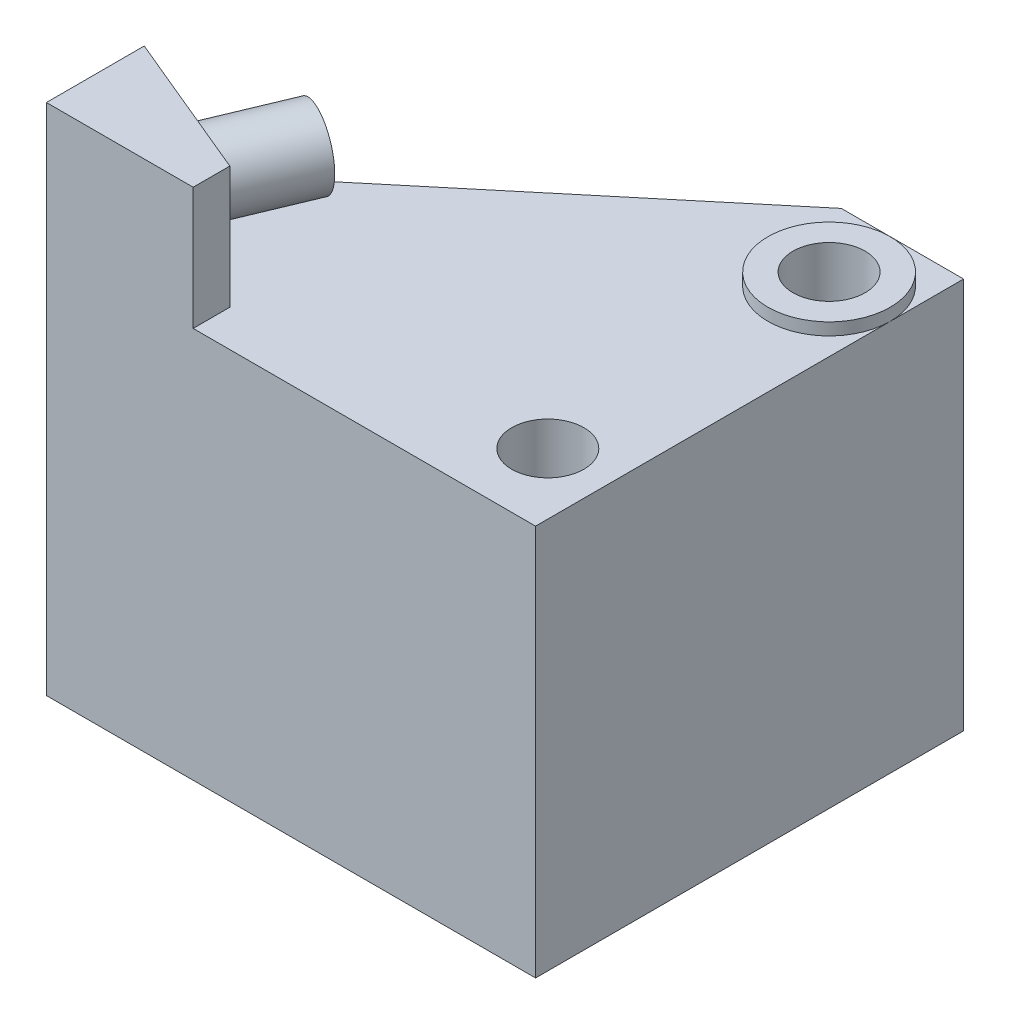
ISO-10303-21;
HEADER;
FILE_DESCRIPTION(('STEP AP214'),'2;1');
FILE_NAME('part.step','',(''),(''),'','','');
FILE_SCHEMA(('AUTOMOTIVE_DESIGN { 1 0 10303 214 1 1 1 1 }'));
ENDSEC;
DATA;
#1=APPLICATION_CONTEXT('core data for automotive mechanical design processes');
#2=APPLICATION_PROTOCOL_DEFINITION('international standard','automotive_design',2000,#1);
#3=PRODUCT_CONTEXT('',#1,'mechanical');
#4=PRODUCT('Part','Part','',(#3));
#5=PRODUCT_RELATED_PRODUCT_CATEGORY('part','',(#4));
#6=PRODUCT_DEFINITION_FORMATION('','',#4);
#7=PRODUCT_DEFINITION_CONTEXT('part definition',#1,'design');
#8=PRODUCT_DEFINITION('design','',#6,#7);
#9=PRODUCT_DEFINITION_SHAPE('','',#8);
#10=(LENGTH_UNIT() NAMED_UNIT(*) SI_UNIT(.MILLI.,.METRE.));
#11=(NAMED_UNIT(*) PLANE_ANGLE_UNIT() SI_UNIT($,.RADIAN.));
#12=(NAMED_UNIT(*) SI_UNIT($,.STERADIAN.) SOLID_ANGLE_UNIT());
#13=UNCERTAINTY_MEASURE_WITH_UNIT(LENGTH_MEASURE(1.E-05),#10,'distance_accuracy_value','');
#14=(GEOMETRIC_REPRESENTATION_CONTEXT(3) GLOBAL_UNCERTAINTY_ASSIGNED_CONTEXT((#13)) GLOBAL_UNIT_ASSIGNED_CONTEXT((#10,
#11,#12)) REPRESENTATION_CONTEXT('',''));
#15=CARTESIAN_POINT('',(0.,0.,0.));
#16=DIRECTION('',(0.,0.,1.));
#17=DIRECTION('',(1.,0.,0.));
#18=AXIS2_PLACEMENT_3D('',#15,#16,#17);
#19=CARTESIAN_POINT('',(0.,16.,0.));
#20=DIRECTION('',(0.,-1.,0.));
#21=DIRECTION('',(0.,0.,-1.));
#22=AXIS2_PLACEMENT_3D('',#19,#20,#21);
#23=PLANE('',#22);
#24=CARTESIAN_POINT('',(-2.5,16.,-3.));
#25=DIRECTION('',(0.,1.,0.));
#26=DIRECTION('',(0.,0.,1.));
#27=AXIS2_PLACEMENT_3D('',#24,#25,#26);
#28=CIRCLE('',#27,1.475);
#29=CARTESIAN_POINT('',(-2.5,16.,-1.525));
#30=VERTEX_POINT('',#29);
#31=EDGE_CURVE('E199',#30,#30,#28,.T.);
#32=ORIENTED_EDGE('',*,*,#31,.F.);
#33=EDGE_LOOP('',(#32));
#34=FACE_BOUND('',#33,.T.);
#35=DIRECTION('',(0.,0.,-1.));
#36=VECTOR('',#35,1.);
#37=CARTESIAN_POINT('',(0.,16.,-17.5));
#38=LINE('',#37,#36);
#39=CARTESIAN_POINT('',(0.,16.,0.));
#40=VERTEX_POINT('',#39);
#41=CARTESIAN_POINT('',(0.,16.,-14.5));
#42=VERTEX_POINT('',#41);
#43=EDGE_CURVE('E112',#40,#42,#38,.T.);
#44=ORIENTED_EDGE('',*,*,#43,.T.);
#45=CARTESIAN_POINT('',(-2.5,16.,-14.5));
#46=DIRECTION('',(0.,1.,0.));
#47=DIRECTION('',(0.,0.,1.));
#48=AXIS2_PLACEMENT_3D('',#45,#46,#47);
#49=CIRCLE('',#48,2.5);
#50=EDGE_CURVE('E115',#42,#42,#49,.T.);
#51=ORIENTED_EDGE('',*,*,#50,.F.);
#52=CARTESIAN_POINT('',(0.,16.,-17.5));
#53=VERTEX_POINT('',#52);
#54=EDGE_CURVE('E122',#42,#53,#38,.T.);
#55=ORIENTED_EDGE('',*,*,#54,.T.);
#56=DIRECTION('',(-1.,0.,0.));
#57=VECTOR('',#56,1.);
#58=CARTESIAN_POINT('',(-5.,16.,-17.5));
#59=LINE('',#58,#57);
#60=CARTESIAN_POINT('',(-5.,16.,-17.5));
#61=VERTEX_POINT('',#60);
#62=EDGE_CURVE('E121',#53,#61,#59,.T.);
#63=ORIENTED_EDGE('',*,*,#62,.T.);
#64=DIRECTION('',(-0.768221279597376,0.,0.64018439966448));
#65=VECTOR('',#64,1.);
#66=CARTESIAN_POINT('',(-20.,16.,-5.));
#67=LINE('',#66,#65);
#68=CARTESIAN_POINT('',(-20.,16.,-5.));
#69=VERTEX_POINT('',#68);
#70=EDGE_CURVE('E136',#61,#69,#67,.T.);
#71=ORIENTED_EDGE('',*,*,#70,.T.);
#72=DIRECTION('',(0.,0.,1.));
#73=VECTOR('',#72,1.);
#74=CARTESIAN_POINT('',(-20.,16.,0.));
#75=LINE('',#74,#73);
#76=CARTESIAN_POINT('',(-20.,16.,-4.));
#77=VERTEX_POINT('',#76);
#78=EDGE_CURVE('E67',#69,#77,#75,.T.);
#79=ORIENTED_EDGE('',*,*,#78,.T.);
#80=DIRECTION('',(-0.923076923076923,0.,-0.384615384615385));
#81=VECTOR('',#80,1.);
#82=CARTESIAN_POINT('',(-14.,16.,-1.5));
#83=LINE('',#82,#81);
#84=CARTESIAN_POINT('',(-14.,16.,-1.5));
#85=VERTEX_POINT('',#84);
#86=EDGE_CURVE('E220',#85,#77,#83,.T.);
#87=ORIENTED_EDGE('',*,*,#86,.F.);
#88=DIRECTION('',(0.,0.,-1.));
#89=VECTOR('',#88,1.);
#90=CARTESIAN_POINT('',(-14.,16.,0.));
#91=LINE('',#90,#89);
#92=CARTESIAN_POINT('',(-14.,16.,0.));
#93=VERTEX_POINT('',#92);
#94=EDGE_CURVE('E61',#93,#85,#91,.T.);
#95=ORIENTED_EDGE('',*,*,#94,.F.);
#96=DIRECTION('',(1.,0.,0.));
#97=VECTOR('',#96,1.);
#98=CARTESIAN_POINT('',(0.,16.,0.));
#99=LINE('',#98,#97);
#100=EDGE_CURVE('E116',#93,#40,#99,.T.);
#101=ORIENTED_EDGE('',*,*,#100,.T.);
#102=EDGE_LOOP('',(#44,#51,#55,#63,#71,#79,#87,#95,#101));
#103=FACE_BOUND('',#102,.T.);
#104=ADVANCED_FACE('F45',(#34,#103),#23,.F.);
#105=CARTESIAN_POINT('',(-20.,16.,0.));
#106=DIRECTION('',(1.,0.,0.));
#107=DIRECTION('',(0.,0.,-1.));
#108=AXIS2_PLACEMENT_3D('',#105,#106,#107);
#109=PLANE('',#108);
#110=DIRECTION('',(0.,0.,1.));
#111=VECTOR('',#110,1.);
#112=CARTESIAN_POINT('',(-20.,0.,0.));
#113=LINE('',#112,#111);
#114=CARTESIAN_POINT('',(-20.,0.,-5.));
#115=VERTEX_POINT('',#114);
#116=CARTESIAN_POINT('',(-20.,0.,0.));
#117=VERTEX_POINT('',#116);
#118=EDGE_CURVE('E140',#115,#117,#113,.T.);
#119=ORIENTED_EDGE('',*,*,#118,.T.);
#120=DIRECTION('',(0.,-1.,0.));
#121=VECTOR('',#120,1.);
#122=CARTESIAN_POINT('',(-20.,16.,0.));
#123=LINE('',#122,#121);
#124=CARTESIAN_POINT('',(-20.,21.,0.));
#125=VERTEX_POINT('',#124);
#126=EDGE_CURVE('E54',#125,#117,#123,.T.);
#127=ORIENTED_EDGE('',*,*,#126,.F.);
#128=DIRECTION('',(0.,0.,1.));
#129=VECTOR('',#128,1.);
#130=CARTESIAN_POINT('',(-20.,21.,-4.));
#131=LINE('',#130,#129);
#132=CARTESIAN_POINT('',(-20.,21.,-4.));
#133=VERTEX_POINT('',#132);
#134=EDGE_CURVE('E228',#133,#125,#131,.T.);
#135=ORIENTED_EDGE('',*,*,#134,.F.);
#136=DIRECTION('',(0.,-1.,0.));
#137=VECTOR('',#136,1.);
#138=CARTESIAN_POINT('',(-20.,21.,-4.));
#139=LINE('',#138,#137);
#140=EDGE_CURVE('E191',#133,#77,#139,.T.);
#141=ORIENTED_EDGE('',*,*,#140,.T.);
#142=ORIENTED_EDGE('',*,*,#78,.F.);
#143=DIRECTION('',(0.,-1.,0.));
#144=VECTOR('',#143,1.);
#145=CARTESIAN_POINT('',(-20.,16.,-5.));
#146=LINE('',#145,#144);
#147=EDGE_CURVE('E139',#69,#115,#146,.T.);
#148=ORIENTED_EDGE('',*,*,#147,.T.);
#149=EDGE_LOOP('',(#119,#127,#135,#141,#142,#148));
#150=FACE_BOUND('',#149,.T.);
#151=ADVANCED_FACE('F47',(#150),#109,.F.);
#152=CARTESIAN_POINT('',(0.,16.,0.));
#153=DIRECTION('',(0.,0.,-1.));
#154=DIRECTION('',(-1.,0.,0.));
#155=AXIS2_PLACEMENT_3D('',#152,#153,#154);
#156=PLANE('',#155);
#157=DIRECTION('',(1.,0.,0.));
#158=VECTOR('',#157,1.);
#159=CARTESIAN_POINT('',(0.,0.,0.));
#160=LINE('',#159,#158);
#161=CARTESIAN_POINT('',(0.,0.,0.));
#162=VERTEX_POINT('',#161);
#163=EDGE_CURVE('E144',#117,#162,#160,.T.);
#164=ORIENTED_EDGE('',*,*,#163,.T.);
#165=DIRECTION('',(0.,-1.,0.));
#166=VECTOR('',#165,1.);
#167=CARTESIAN_POINT('',(0.,16.,0.));
#168=LINE('',#167,#166);
#169=EDGE_CURVE('E166',#40,#162,#168,.T.);
#170=ORIENTED_EDGE('',*,*,#169,.F.);
#171=ORIENTED_EDGE('',*,*,#100,.F.);
#172=DIRECTION('',(0.,-1.,0.));
#173=VECTOR('',#172,1.);
#174=CARTESIAN_POINT('',(-14.,21.,0.));
#175=LINE('',#174,#173);
#176=CARTESIAN_POINT('',(-14.,21.,0.));
#177=VERTEX_POINT('',#176);
#178=EDGE_CURVE('E208',#177,#93,#175,.T.);
#179=ORIENTED_EDGE('',*,*,#178,.F.);
#180=DIRECTION('',(1.,0.,0.));
#181=VECTOR('',#180,1.);
#182=CARTESIAN_POINT('',(-20.,21.,0.));
#183=LINE('',#182,#181);
#184=EDGE_CURVE('E174',#125,#177,#183,.T.);
#185=ORIENTED_EDGE('',*,*,#184,.F.);
#186=ORIENTED_EDGE('',*,*,#126,.T.);
#187=EDGE_LOOP('',(#164,#170,#171,#179,#185,#186));
#188=FACE_BOUND('',#187,.T.);
#189=ADVANCED_FACE('F172',(#188),#156,.F.);
#190=CARTESIAN_POINT('',(0.,16.,-17.5));
#191=DIRECTION('',(-1.,0.,0.));
#192=DIRECTION('',(0.,0.,1.));
#193=AXIS2_PLACEMENT_3D('',#190,#191,#192);
#194=PLANE('',#193);
#195=DIRECTION('',(0.,0.,-1.));
#196=VECTOR('',#195,1.);
#197=CARTESIAN_POINT('',(0.,0.,-17.5));
#198=LINE('',#197,#196);
#199=CARTESIAN_POINT('',(0.,0.,-17.5));
#200=VERTEX_POINT('',#199);
#201=EDGE_CURVE('E148',#162,#200,#198,.T.);
#202=ORIENTED_EDGE('',*,*,#201,.T.);
#203=DIRECTION('',(0.,-1.,0.));
#204=VECTOR('',#203,1.);
#205=CARTESIAN_POINT('',(0.,16.,-17.5));
#206=LINE('',#205,#204);
#207=EDGE_CURVE('E127',#53,#200,#206,.T.);
#208=ORIENTED_EDGE('',*,*,#207,.F.);
#209=ORIENTED_EDGE('',*,*,#54,.F.);
#210=ORIENTED_EDGE('',*,*,#43,.F.);
#211=ORIENTED_EDGE('',*,*,#169,.T.);
#212=EDGE_LOOP('',(#202,#208,#209,#210,#211));
#213=FACE_BOUND('',#212,.T.);
#214=ADVANCED_FACE('F125',(#213),#194,.F.);
#215=CARTESIAN_POINT('',(-5.,16.,-17.5));
#216=DIRECTION('',(0.,0.,1.));
#217=DIRECTION('',(1.,0.,0.));
#218=AXIS2_PLACEMENT_3D('',#215,#216,#217);
#219=PLANE('',#218);
#220=DIRECTION('',(-1.,0.,0.));
#221=VECTOR('',#220,1.);
#222=CARTESIAN_POINT('',(-5.,0.,-17.5));
#223=LINE('',#222,#221);
#224=CARTESIAN_POINT('',(-5.,0.,-17.5));
#225=VERTEX_POINT('',#224);
#226=EDGE_CURVE('E151',#200,#225,#223,.T.);
#227=ORIENTED_EDGE('',*,*,#226,.T.);
#228=DIRECTION('',(0.,-1.,0.));
#229=VECTOR('',#228,1.);
#230=CARTESIAN_POINT('',(-5.,16.,-17.5));
#231=LINE('',#230,#229);
#232=EDGE_CURVE('E160',#61,#225,#231,.T.);
#233=ORIENTED_EDGE('',*,*,#232,.F.);
#234=ORIENTED_EDGE('',*,*,#62,.F.);
#235=ORIENTED_EDGE('',*,*,#207,.T.);
#236=EDGE_LOOP('',(#227,#233,#234,#235));
#237=FACE_BOUND('',#236,.T.);
#238=ADVANCED_FACE('F185',(#237),#219,.F.);
#239=CARTESIAN_POINT('',(-20.,16.,-5.));
#240=DIRECTION('',(0.64018439966448,0.,0.768221279597376));
#241=DIRECTION('',(0.768221279597376,0.,-0.64018439966448));
#242=AXIS2_PLACEMENT_3D('',#239,#240,#241);
#243=PLANE('',#242);
#244=DIRECTION('',(-0.768221279597376,0.,0.64018439966448));
#245=VECTOR('',#244,1.);
#246=CARTESIAN_POINT('',(-20.,0.,-5.));
#247=LINE('',#246,#245);
#248=EDGE_CURVE('E154',#225,#115,#247,.T.);
#249=ORIENTED_EDGE('',*,*,#248,.T.);
#250=ORIENTED_EDGE('',*,*,#147,.F.);
#251=ORIENTED_EDGE('',*,*,#70,.F.);
#252=ORIENTED_EDGE('',*,*,#232,.T.);
#253=EDGE_LOOP('',(#249,#250,#251,#252));
#254=FACE_BOUND('',#253,.T.);
#255=ADVANCED_FACE('F189',(#254),#243,.F.);
#256=CARTESIAN_POINT('',(0.,0.,0.));
#257=DIRECTION('',(0.,-1.,0.));
#258=DIRECTION('',(0.,0.,-1.));
#259=AXIS2_PLACEMENT_3D('',#256,#257,#258);
#260=PLANE('',#259);
#261=CARTESIAN_POINT('',(-2.5,0.,-14.5));
#262=DIRECTION('',(0.,1.,0.));
#263=DIRECTION('',(0.,0.,1.));
#264=AXIS2_PLACEMENT_3D('',#261,#262,#263);
#265=CIRCLE('',#264,1.475);
#266=CARTESIAN_POINT('',(-2.5,0.,-13.025));
#267=VERTEX_POINT('',#266);
#268=EDGE_CURVE('E145',#267,#267,#265,.T.);
#269=ORIENTED_EDGE('',*,*,#268,.T.);
#270=EDGE_LOOP('',(#269));
#271=FACE_BOUND('',#270,.T.);
#272=CARTESIAN_POINT('',(-2.5,0.,-3.));
#273=DIRECTION('',(0.,1.,0.));
#274=DIRECTION('',(0.,0.,1.));
#275=AXIS2_PLACEMENT_3D('',#272,#273,#274);
#276=CIRCLE('',#275,1.475);
#277=CARTESIAN_POINT('',(-2.5,0.,-1.525));
#278=VERTEX_POINT('',#277);
#279=EDGE_CURVE('E195',#278,#278,#276,.T.);
#280=ORIENTED_EDGE('',*,*,#279,.T.);
#281=EDGE_LOOP('',(#280));
#282=FACE_BOUND('',#281,.T.);
#283=ORIENTED_EDGE('',*,*,#118,.F.);
#284=ORIENTED_EDGE('',*,*,#248,.F.);
#285=ORIENTED_EDGE('',*,*,#226,.F.);
#286=ORIENTED_EDGE('',*,*,#201,.F.);
#287=ORIENTED_EDGE('',*,*,#163,.F.);
#288=EDGE_LOOP('',(#283,#284,#285,#286,#287));
#289=FACE_BOUND('',#288,.T.);
#290=ADVANCED_FACE('F181',(#271,#282,#289),#260,.T.);
#291=CARTESIAN_POINT('',(-2.5,0.,-3.));
#292=DIRECTION('',(0.,1.,0.));
#293=DIRECTION('',(0.,0.,1.));
#294=AXIS2_PLACEMENT_3D('',#291,#292,#293);
#295=CYLINDRICAL_SURFACE('',#294,1.475);
#296=ORIENTED_EDGE('',*,*,#279,.F.);
#297=EDGE_LOOP('',(#296));
#298=FACE_BOUND('',#297,.T.);
#299=ORIENTED_EDGE('',*,*,#31,.T.);
#300=EDGE_LOOP('',(#299));
#301=FACE_BOUND('',#300,.T.);
#302=ADVANCED_FACE('F290',(#298,#301),#295,.F.);
#303=CARTESIAN_POINT('',(-2.5,0.,-14.5));
#304=DIRECTION('',(0.,1.,0.));
#305=DIRECTION('',(0.,0.,1.));
#306=AXIS2_PLACEMENT_3D('',#303,#304,#305);
#307=CYLINDRICAL_SURFACE('',#306,1.475);
#308=ORIENTED_EDGE('',*,*,#268,.F.);
#309=EDGE_LOOP('',(#308));
#310=FACE_BOUND('',#309,.T.);
#311=CARTESIAN_POINT('',(-2.5,16.5,-14.5));
#312=DIRECTION('',(0.,1.,0.));
#313=DIRECTION('',(0.,0.,1.));
#314=AXIS2_PLACEMENT_3D('',#311,#312,#313);
#315=CIRCLE('',#314,1.475);
#316=CARTESIAN_POINT('',(-2.5,16.5,-13.025));
#317=VERTEX_POINT('',#316);
#318=EDGE_CURVE('E236',#317,#317,#315,.T.);
#319=ORIENTED_EDGE('',*,*,#318,.T.);
#320=EDGE_LOOP('',(#319));
#321=FACE_BOUND('',#320,.T.);
#322=ADVANCED_FACE('F261',(#310,#321),#307,.F.);
#323=CARTESIAN_POINT('',(-14.,21.,-1.5));
#324=DIRECTION('',(-0.384615384615385,0.,0.923076923076923));
#325=DIRECTION('',(0.923076923076923,0.,0.384615384615385));
#326=AXIS2_PLACEMENT_3D('',#323,#324,#325);
#327=PLANE('',#326);
#328=CARTESIAN_POINT('',(-17.,18.5,-2.75000000000001));
#329=DIRECTION('',(-0.384615384615385,0.,0.923076923076923));
#330=DIRECTION('',(0.923076923076923,0.,0.384615384615385));
#331=AXIS2_PLACEMENT_3D('',#328,#329,#330);
#332=CIRCLE('',#331,1.5);
#333=CARTESIAN_POINT('',(-15.6153846153847,18.5,-2.17307692307694));
#334=VERTEX_POINT('',#333);
#335=EDGE_CURVE('E11',#334,#334,#332,.F.);
#336=ORIENTED_EDGE('',*,*,#335,.F.);
#337=EDGE_LOOP('',(#336));
#338=FACE_BOUND('',#337,.T.);
#339=ORIENTED_EDGE('',*,*,#86,.T.);
#340=ORIENTED_EDGE('',*,*,#140,.F.);
#341=DIRECTION('',(-0.923076923076923,0.,-0.384615384615385));
#342=VECTOR('',#341,1.);
#343=CARTESIAN_POINT('',(-14.,21.,-1.5));
#344=LINE('',#343,#342);
#345=CARTESIAN_POINT('',(-14.,21.,-1.5));
#346=VERTEX_POINT('',#345);
#347=EDGE_CURVE('E219',#346,#133,#344,.T.);
#348=ORIENTED_EDGE('',*,*,#347,.F.);
#349=DIRECTION('',(0.,-1.,0.));
#350=VECTOR('',#349,1.);
#351=CARTESIAN_POINT('',(-14.,21.,-1.5));
#352=LINE('',#351,#350);
#353=EDGE_CURVE('E212',#346,#85,#352,.T.);
#354=ORIENTED_EDGE('',*,*,#353,.T.);
#355=EDGE_LOOP('',(#339,#340,#348,#354));
#356=FACE_BOUND('',#355,.T.);
#357=ADVANCED_FACE('F257',(#338,#356),#327,.F.);
#358=CARTESIAN_POINT('',(-14.,21.,0.));
#359=DIRECTION('',(-1.,0.,0.));
#360=DIRECTION('',(0.,0.,1.));
#361=AXIS2_PLACEMENT_3D('',#358,#359,#360);
#362=PLANE('',#361);
#363=ORIENTED_EDGE('',*,*,#94,.T.);
#364=ORIENTED_EDGE('',*,*,#353,.F.);
#365=DIRECTION('',(0.,0.,-1.));
#366=VECTOR('',#365,1.);
#367=CARTESIAN_POINT('',(-14.,21.,0.));
#368=LINE('',#367,#366);
#369=EDGE_CURVE('E216',#177,#346,#368,.T.);
#370=ORIENTED_EDGE('',*,*,#369,.F.);
#371=ORIENTED_EDGE('',*,*,#178,.T.);
#372=EDGE_LOOP('',(#363,#364,#370,#371));
#373=FACE_BOUND('',#372,.T.);
#374=ADVANCED_FACE('F260',(#373),#362,.F.);
#375=CARTESIAN_POINT('',(0.,21.,0.));
#376=DIRECTION('',(0.,1.,0.));
#377=DIRECTION('',(0.,0.,1.));
#378=AXIS2_PLACEMENT_3D('',#375,#376,#377);
#379=PLANE('',#378);
#380=ORIENTED_EDGE('',*,*,#347,.T.);
#381=ORIENTED_EDGE('',*,*,#134,.T.);
#382=ORIENTED_EDGE('',*,*,#184,.T.);
#383=ORIENTED_EDGE('',*,*,#369,.T.);
#384=EDGE_LOOP('',(#380,#381,#382,#383));
#385=FACE_BOUND('',#384,.T.);
#386=ADVANCED_FACE('F268',(#385),#379,.T.);
#387=CARTESIAN_POINT('',(-2.5,16.5,-14.5));
#388=DIRECTION('',(0.,1.,0.));
#389=DIRECTION('',(0.,0.,1.));
#390=AXIS2_PLACEMENT_3D('',#387,#388,#389);
#391=PLANE('',#390);
#392=CARTESIAN_POINT('',(-2.5,16.5,-14.5));
#393=DIRECTION('',(0.,1.,0.));
#394=DIRECTION('',(0.,0.,1.));
#395=AXIS2_PLACEMENT_3D('',#392,#393,#394);
#396=CIRCLE('',#395,2.5);
#397=CARTESIAN_POINT('',(-2.5,16.5,-12.));
#398=VERTEX_POINT('',#397);
#399=EDGE_CURVE('E223',#398,#398,#396,.T.);
#400=ORIENTED_EDGE('',*,*,#399,.T.);
#401=EDGE_LOOP('',(#400));
#402=FACE_BOUND('',#401,.T.);
#403=ORIENTED_EDGE('',*,*,#318,.F.);
#404=EDGE_LOOP('',(#403));
#405=FACE_BOUND('',#404,.T.);
#406=ADVANCED_FACE('F270',(#402,#405),#391,.T.);
#407=CARTESIAN_POINT('',(-2.5,16.5,-14.5));
#408=DIRECTION('',(0.,-1.,0.));
#409=DIRECTION('',(0.,0.,-1.));
#410=AXIS2_PLACEMENT_3D('',#407,#408,#409);
#411=CYLINDRICAL_SURFACE('',#410,2.5);
#412=ORIENTED_EDGE('',*,*,#399,.F.);
#413=EDGE_LOOP('',(#412));
#414=FACE_BOUND('',#413,.T.);
#415=ORIENTED_EDGE('',*,*,#50,.T.);
#416=EDGE_LOOP('',(#415));
#417=FACE_BOUND('',#416,.T.);
#418=ADVANCED_FACE('F253',(#414,#417),#411,.T.);
#419=CARTESIAN_POINT('',(-15.4615384615385,18.5,-6.44230769230771));
#420=DIRECTION('',(-0.384615384615385,0.,0.923076923076923));
#421=DIRECTION('',(0.923076923076923,0.,0.384615384615385));
#422=AXIS2_PLACEMENT_3D('',#419,#420,#421);
#423=CYLINDRICAL_SURFACE('',#422,1.5);
#424=CARTESIAN_POINT('',(-15.4615384615385,18.5,-6.44230769230771));
#425=DIRECTION('',(0.384615384615385,0.,-0.923076923076923));
#426=DIRECTION('',(-0.923076923076923,0.,-0.384615384615385));
#427=AXIS2_PLACEMENT_3D('',#424,#425,#426);
#428=CIRCLE('',#427,1.5);
#429=CARTESIAN_POINT('',(-16.8461538461539,18.5,-7.01923076923078));
#430=VERTEX_POINT('',#429);
#431=EDGE_CURVE('E243',#430,#430,#428,.T.);
#432=ORIENTED_EDGE('',*,*,#431,.F.);
#433=EDGE_LOOP('',(#432));
#434=FACE_BOUND('',#433,.T.);
#435=ORIENTED_EDGE('',*,*,#335,.T.);
#436=EDGE_LOOP('',(#435));
#437=FACE_BOUND('',#436,.T.);
#438=ADVANCED_FACE('F250',(#434,#437),#423,.T.);
#439=CARTESIAN_POINT('',(-15.4615384615385,18.5,-6.44230769230771));
#440=DIRECTION('',(0.384615384615385,0.,-0.923076923076923));
#441=DIRECTION('',(-0.923076923076923,0.,-0.384615384615385));
#442=AXIS2_PLACEMENT_3D('',#439,#440,#441);
#443=PLANE('',#442);
#444=ORIENTED_EDGE('',*,*,#431,.T.);
#445=EDGE_LOOP('',(#444));
#446=FACE_BOUND('',#445,.T.);
#447=ADVANCED_FACE('F248',(#446),#443,.T.);
#448=CLOSED_SHELL('',(#104,#151,#189,#214,#238,#255,#290,#302,#322,#357,#374,#386,#406,#418,
#438,#447));
#449=MANIFOLD_SOLID_BREP('B2',#448);
#450=ADVANCED_BREP_SHAPE_REPRESENTATION('',(#18,#449),#14);
#451=SHAPE_DEFINITION_REPRESENTATION(#9,#450);
ENDSEC;
END-ISO-10303-21;
